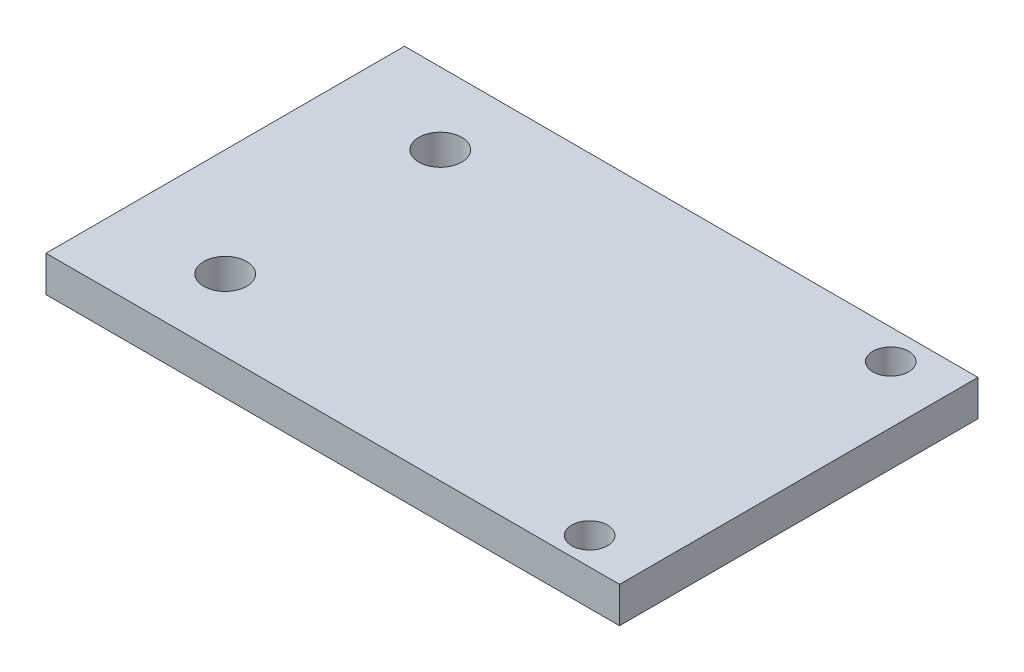
ISO-10303-21;
HEADER;
FILE_DESCRIPTION(('STEP AP214'),'2;1');
FILE_NAME('part.step','',(''),(''),'','','');
FILE_SCHEMA(('AUTOMOTIVE_DESIGN { 1 0 10303 214 1 1 1 1 }'));
ENDSEC;
DATA;
#1=APPLICATION_CONTEXT('core data for automotive mechanical design processes');
#2=APPLICATION_PROTOCOL_DEFINITION('international standard','automotive_design',2000,#1);
#3=PRODUCT_CONTEXT('',#1,'mechanical');
#4=PRODUCT('Part','Part','',(#3));
#5=PRODUCT_RELATED_PRODUCT_CATEGORY('part','',(#4));
#6=PRODUCT_DEFINITION_FORMATION('','',#4);
#7=PRODUCT_DEFINITION_CONTEXT('part definition',#1,'design');
#8=PRODUCT_DEFINITION('design','',#6,#7);
#9=PRODUCT_DEFINITION_SHAPE('','',#8);
#10=(LENGTH_UNIT() NAMED_UNIT(*) SI_UNIT(.MILLI.,.METRE.));
#11=(NAMED_UNIT(*) PLANE_ANGLE_UNIT() SI_UNIT($,.RADIAN.));
#12=(NAMED_UNIT(*) SI_UNIT($,.STERADIAN.) SOLID_ANGLE_UNIT());
#13=UNCERTAINTY_MEASURE_WITH_UNIT(LENGTH_MEASURE(1.E-05),#10,'distance_accuracy_value','');
#14=(GEOMETRIC_REPRESENTATION_CONTEXT(3) GLOBAL_UNCERTAINTY_ASSIGNED_CONTEXT((#13)) GLOBAL_UNIT_ASSIGNED_CONTEXT((#10,
#11,#12)) REPRESENTATION_CONTEXT('',''));
#15=CARTESIAN_POINT('',(0.,0.,0.));
#16=DIRECTION('',(0.,0.,1.));
#17=DIRECTION('',(1.,0.,0.));
#18=AXIS2_PLACEMENT_3D('',#15,#16,#17);
#19=CARTESIAN_POINT('',(0.,5.,0.));
#20=DIRECTION('',(0.,-1.,0.));
#21=DIRECTION('',(0.,0.,-1.));
#22=AXIS2_PLACEMENT_3D('',#19,#20,#21);
#23=PLANE('',#22);
#24=CARTESIAN_POINT('',(72.0000000000001,5.,-45.8280269591615));
#25=DIRECTION('',(0.,1.,0.));
#26=DIRECTION('',(0.,0.,1.));
#27=AXIS2_PLACEMENT_3D('',#24,#25,#26);
#28=CIRCLE('',#27,2.5);
#29=CARTESIAN_POINT('',(72.0000000000001,5.,-43.3280269591616));
#30=VERTEX_POINT('',#29);
#31=EDGE_CURVE('E122',#30,#30,#28,.T.);
#32=ORIENTED_EDGE('',*,*,#31,.F.);
#33=EDGE_LOOP('',(#32));
#34=FACE_BOUND('',#33,.T.);
#35=CARTESIAN_POINT('',(72.0000000000003,5.,-3.82802695916155));
#36=DIRECTION('',(0.,1.,0.));
#37=DIRECTION('',(0.,0.,1.));
#38=AXIS2_PLACEMENT_3D('',#35,#36,#37);
#39=CIRCLE('',#38,2.49999999999999);
#40=CARTESIAN_POINT('',(72.0000000000003,5.,-1.32802695916155));
#41=VERTEX_POINT('',#40);
#42=EDGE_CURVE('E111',#41,#41,#39,.T.);
#43=ORIENTED_EDGE('',*,*,#42,.F.);
#44=EDGE_LOOP('',(#43));
#45=FACE_BOUND('',#44,.T.);
#46=DIRECTION('',(0.,0.,1.));
#47=VECTOR('',#46,1.);
#48=CARTESIAN_POINT('',(0.,5.,0.));
#49=LINE('',#48,#47);
#50=CARTESIAN_POINT('',(0.,5.,-50.));
#51=VERTEX_POINT('',#50);
#52=CARTESIAN_POINT('',(0.,5.,0.));
#53=VERTEX_POINT('',#52);
#54=EDGE_CURVE('E87',#51,#53,#49,.T.);
#55=ORIENTED_EDGE('',*,*,#54,.T.);
#56=DIRECTION('',(1.,0.,0.));
#57=VECTOR('',#56,1.);
#58=CARTESIAN_POINT('',(0.,5.,0.));
#59=LINE('',#58,#57);
#60=CARTESIAN_POINT('',(80.,5.,0.));
#61=VERTEX_POINT('',#60);
#62=EDGE_CURVE('E82',#53,#61,#59,.T.);
#63=ORIENTED_EDGE('',*,*,#62,.T.);
#64=DIRECTION('',(0.,0.,-1.));
#65=VECTOR('',#64,1.);
#66=CARTESIAN_POINT('',(80.,5.,0.));
#67=LINE('',#66,#65);
#68=CARTESIAN_POINT('',(80.,5.,-50.));
#69=VERTEX_POINT('',#68);
#70=EDGE_CURVE('E85',#61,#69,#67,.T.);
#71=ORIENTED_EDGE('',*,*,#70,.T.);
#72=DIRECTION('',(-1.,0.,0.));
#73=VECTOR('',#72,1.);
#74=CARTESIAN_POINT('',(0.,5.,-50.));
#75=LINE('',#74,#73);
#76=EDGE_CURVE('E52',#69,#51,#75,.T.);
#77=ORIENTED_EDGE('',*,*,#76,.T.);
#78=EDGE_LOOP('',(#55,#63,#71,#77));
#79=FACE_BOUND('',#78,.T.);
#80=CARTESIAN_POINT('',(15.,5.,-40.));
#81=DIRECTION('',(0.,1.,0.));
#82=DIRECTION('',(0.,0.,1.));
#83=AXIS2_PLACEMENT_3D('',#80,#81,#82);
#84=CIRCLE('',#83,3.);
#85=CARTESIAN_POINT('',(15.,5.,-37.));
#86=VERTEX_POINT('',#85);
#87=EDGE_CURVE('E103',#86,#86,#84,.T.);
#88=ORIENTED_EDGE('',*,*,#87,.F.);
#89=EDGE_LOOP('',(#88));
#90=FACE_BOUND('',#89,.T.);
#91=CARTESIAN_POINT('',(15.,5.,-10.));
#92=DIRECTION('',(0.,1.,0.));
#93=DIRECTION('',(0.,0.,1.));
#94=AXIS2_PLACEMENT_3D('',#91,#92,#93);
#95=CIRCLE('',#94,3.);
#96=CARTESIAN_POINT('',(15.,5.,-7.00000000000001));
#97=VERTEX_POINT('',#96);
#98=EDGE_CURVE('E115',#97,#97,#95,.T.);
#99=ORIENTED_EDGE('',*,*,#98,.F.);
#100=EDGE_LOOP('',(#99));
#101=FACE_BOUND('',#100,.T.);
#102=ADVANCED_FACE('F33',(#34,#45,#79,#90,#101),#23,.F.);
#103=CARTESIAN_POINT('',(0.,0.,0.));
#104=DIRECTION('',(0.,-1.,0.));
#105=DIRECTION('',(0.,0.,-1.));
#106=AXIS2_PLACEMENT_3D('',#103,#104,#105);
#107=PLANE('',#106);
#108=CARTESIAN_POINT('',(72.0000000000001,0.,-45.8280269591615));
#109=DIRECTION('',(0.,-1.,0.));
#110=DIRECTION('',(0.,0.,-1.));
#111=AXIS2_PLACEMENT_3D('',#108,#109,#110);
#112=CIRCLE('',#111,2.5);
#113=CARTESIAN_POINT('',(72.0000000000001,0.,-48.3280269591615));
#114=VERTEX_POINT('',#113);
#115=EDGE_CURVE('E37',#114,#114,#112,.T.);
#116=ORIENTED_EDGE('',*,*,#115,.F.);
#117=EDGE_LOOP('',(#116));
#118=FACE_BOUND('',#117,.T.);
#119=CARTESIAN_POINT('',(72.0000000000003,0.,-3.82802695916155));
#120=DIRECTION('',(0.,-1.,0.));
#121=DIRECTION('',(0.,0.,-1.));
#122=AXIS2_PLACEMENT_3D('',#119,#120,#121);
#123=CIRCLE('',#122,2.49999999999999);
#124=CARTESIAN_POINT('',(72.0000000000003,0.,-6.32802695916154));
#125=VERTEX_POINT('',#124);
#126=EDGE_CURVE('E108',#125,#125,#123,.T.);
#127=ORIENTED_EDGE('',*,*,#126,.F.);
#128=EDGE_LOOP('',(#127));
#129=FACE_BOUND('',#128,.T.);
#130=CARTESIAN_POINT('',(15.,0.,-40.));
#131=DIRECTION('',(0.,1.,0.));
#132=DIRECTION('',(0.,0.,1.));
#133=AXIS2_PLACEMENT_3D('',#130,#131,#132);
#134=CIRCLE('',#133,3.);
#135=CARTESIAN_POINT('',(15.,0.,-37.));
#136=VERTEX_POINT('',#135);
#137=EDGE_CURVE('E126',#136,#136,#134,.T.);
#138=ORIENTED_EDGE('',*,*,#137,.T.);
#139=EDGE_LOOP('',(#138));
#140=FACE_BOUND('',#139,.T.);
#141=DIRECTION('',(0.,0.,1.));
#142=VECTOR('',#141,1.);
#143=CARTESIAN_POINT('',(0.,0.,0.));
#144=LINE('',#143,#142);
#145=CARTESIAN_POINT('',(0.,0.,-50.));
#146=VERTEX_POINT('',#145);
#147=CARTESIAN_POINT('',(0.,0.,0.));
#148=VERTEX_POINT('',#147);
#149=EDGE_CURVE('E100',#146,#148,#144,.T.);
#150=ORIENTED_EDGE('',*,*,#149,.F.);
#151=DIRECTION('',(-1.,0.,0.));
#152=VECTOR('',#151,1.);
#153=CARTESIAN_POINT('',(0.,0.,-50.));
#154=LINE('',#153,#152);
#155=CARTESIAN_POINT('',(80.,0.,-50.));
#156=VERTEX_POINT('',#155);
#157=EDGE_CURVE('E75',#156,#146,#154,.T.);
#158=ORIENTED_EDGE('',*,*,#157,.F.);
#159=DIRECTION('',(0.,0.,-1.));
#160=VECTOR('',#159,1.);
#161=CARTESIAN_POINT('',(80.,0.,0.));
#162=LINE('',#161,#160);
#163=CARTESIAN_POINT('',(80.,0.,0.));
#164=VERTEX_POINT('',#163);
#165=EDGE_CURVE('E69',#164,#156,#162,.T.);
#166=ORIENTED_EDGE('',*,*,#165,.F.);
#167=DIRECTION('',(1.,0.,0.));
#168=VECTOR('',#167,1.);
#169=CARTESIAN_POINT('',(0.,0.,0.));
#170=LINE('',#169,#168);
#171=EDGE_CURVE('E91',#148,#164,#170,.T.);
#172=ORIENTED_EDGE('',*,*,#171,.F.);
#173=EDGE_LOOP('',(#150,#158,#166,#172));
#174=FACE_BOUND('',#173,.T.);
#175=CARTESIAN_POINT('',(15.,0.,-10.));
#176=DIRECTION('',(0.,1.,0.));
#177=DIRECTION('',(0.,0.,1.));
#178=AXIS2_PLACEMENT_3D('',#175,#176,#177);
#179=CIRCLE('',#178,3.);
#180=CARTESIAN_POINT('',(15.,0.,-7.00000000000001));
#181=VERTEX_POINT('',#180);
#182=EDGE_CURVE('E110',#181,#181,#179,.T.);
#183=ORIENTED_EDGE('',*,*,#182,.T.);
#184=EDGE_LOOP('',(#183));
#185=FACE_BOUND('',#184,.T.);
#186=ADVANCED_FACE('F133',(#118,#129,#140,#174,#185),#107,.T.);
#187=CARTESIAN_POINT('',(0.,5.,0.));
#188=DIRECTION('',(1.,0.,0.));
#189=DIRECTION('',(0.,0.,-1.));
#190=AXIS2_PLACEMENT_3D('',#187,#188,#189);
#191=PLANE('',#190);
#192=ORIENTED_EDGE('',*,*,#149,.T.);
#193=DIRECTION('',(0.,-1.,0.));
#194=VECTOR('',#193,1.);
#195=CARTESIAN_POINT('',(0.,5.,0.));
#196=LINE('',#195,#194);
#197=EDGE_CURVE('E11',#53,#148,#196,.T.);
#198=ORIENTED_EDGE('',*,*,#197,.F.);
#199=ORIENTED_EDGE('',*,*,#54,.F.);
#200=DIRECTION('',(0.,-1.,0.));
#201=VECTOR('',#200,1.);
#202=CARTESIAN_POINT('',(0.,5.,-50.));
#203=LINE('',#202,#201);
#204=EDGE_CURVE('E96',#51,#146,#203,.T.);
#205=ORIENTED_EDGE('',*,*,#204,.T.);
#206=EDGE_LOOP('',(#192,#198,#199,#205));
#207=FACE_BOUND('',#206,.T.);
#208=ADVANCED_FACE('F35',(#207),#191,.F.);
#209=CARTESIAN_POINT('',(0.,5.,0.));
#210=DIRECTION('',(0.,0.,-1.));
#211=DIRECTION('',(-1.,0.,0.));
#212=AXIS2_PLACEMENT_3D('',#209,#210,#211);
#213=PLANE('',#212);
#214=ORIENTED_EDGE('',*,*,#171,.T.);
#215=DIRECTION('',(0.,-1.,0.));
#216=VECTOR('',#215,1.);
#217=CARTESIAN_POINT('',(80.,5.,0.));
#218=LINE('',#217,#216);
#219=EDGE_CURVE('E43',#61,#164,#218,.T.);
#220=ORIENTED_EDGE('',*,*,#219,.F.);
#221=ORIENTED_EDGE('',*,*,#62,.F.);
#222=ORIENTED_EDGE('',*,*,#197,.T.);
#223=EDGE_LOOP('',(#214,#220,#221,#222));
#224=FACE_BOUND('',#223,.T.);
#225=ADVANCED_FACE('F90',(#224),#213,.F.);
#226=CARTESIAN_POINT('',(80.,5.,0.));
#227=DIRECTION('',(-1.,0.,0.));
#228=DIRECTION('',(0.,0.,1.));
#229=AXIS2_PLACEMENT_3D('',#226,#227,#228);
#230=PLANE('',#229);
#231=ORIENTED_EDGE('',*,*,#165,.T.);
#232=DIRECTION('',(0.,-1.,0.));
#233=VECTOR('',#232,1.);
#234=CARTESIAN_POINT('',(80.,5.,-50.));
#235=LINE('',#234,#233);
#236=EDGE_CURVE('E92',#69,#156,#235,.T.);
#237=ORIENTED_EDGE('',*,*,#236,.F.);
#238=ORIENTED_EDGE('',*,*,#70,.F.);
#239=ORIENTED_EDGE('',*,*,#219,.T.);
#240=EDGE_LOOP('',(#231,#237,#238,#239));
#241=FACE_BOUND('',#240,.T.);
#242=ADVANCED_FACE('F94',(#241),#230,.F.);
#243=CARTESIAN_POINT('',(0.,5.,-50.));
#244=DIRECTION('',(0.,0.,1.));
#245=DIRECTION('',(1.,0.,0.));
#246=AXIS2_PLACEMENT_3D('',#243,#244,#245);
#247=PLANE('',#246);
#248=ORIENTED_EDGE('',*,*,#157,.T.);
#249=ORIENTED_EDGE('',*,*,#204,.F.);
#250=ORIENTED_EDGE('',*,*,#76,.F.);
#251=ORIENTED_EDGE('',*,*,#236,.T.);
#252=EDGE_LOOP('',(#248,#249,#250,#251));
#253=FACE_BOUND('',#252,.T.);
#254=ADVANCED_FACE('F139',(#253),#247,.F.);
#255=CARTESIAN_POINT('',(15.,5.,-40.));
#256=DIRECTION('',(0.,-1.,0.));
#257=DIRECTION('',(0.,0.,-1.));
#258=AXIS2_PLACEMENT_3D('',#255,#256,#257);
#259=CYLINDRICAL_SURFACE('',#258,3.);
#260=ORIENTED_EDGE('',*,*,#87,.T.);
#261=EDGE_LOOP('',(#260));
#262=FACE_BOUND('',#261,.T.);
#263=ORIENTED_EDGE('',*,*,#137,.F.);
#264=EDGE_LOOP('',(#263));
#265=FACE_BOUND('',#264,.T.);
#266=ADVANCED_FACE('F136',(#262,#265),#259,.F.);
#267=CARTESIAN_POINT('',(15.,5.,-10.));
#268=DIRECTION('',(0.,-1.,0.));
#269=DIRECTION('',(0.,0.,-1.));
#270=AXIS2_PLACEMENT_3D('',#267,#268,#269);
#271=CYLINDRICAL_SURFACE('',#270,3.);
#272=ORIENTED_EDGE('',*,*,#98,.T.);
#273=EDGE_LOOP('',(#272));
#274=FACE_BOUND('',#273,.T.);
#275=ORIENTED_EDGE('',*,*,#182,.F.);
#276=EDGE_LOOP('',(#275));
#277=FACE_BOUND('',#276,.T.);
#278=ADVANCED_FACE('F138',(#274,#277),#271,.F.);
#279=CARTESIAN_POINT('',(72.0000000000003,-5.,-3.82802695916155));
#280=DIRECTION('',(0.,1.,0.));
#281=DIRECTION('',(0.,0.,1.));
#282=AXIS2_PLACEMENT_3D('',#279,#280,#281);
#283=CYLINDRICAL_SURFACE('',#282,2.49999999999999);
#284=ORIENTED_EDGE('',*,*,#126,.T.);
#285=EDGE_LOOP('',(#284));
#286=FACE_BOUND('',#285,.T.);
#287=ORIENTED_EDGE('',*,*,#42,.T.);
#288=EDGE_LOOP('',(#287));
#289=FACE_BOUND('',#288,.T.);
#290=ADVANCED_FACE('F146',(#286,#289),#283,.F.);
#291=CARTESIAN_POINT('',(72.0000000000001,-5.,-45.8280269591615));
#292=DIRECTION('',(0.,1.,0.));
#293=DIRECTION('',(0.,0.,1.));
#294=AXIS2_PLACEMENT_3D('',#291,#292,#293);
#295=CYLINDRICAL_SURFACE('',#294,2.5);
#296=ORIENTED_EDGE('',*,*,#115,.T.);
#297=EDGE_LOOP('',(#296));
#298=FACE_BOUND('',#297,.T.);
#299=ORIENTED_EDGE('',*,*,#31,.T.);
#300=EDGE_LOOP('',(#299));
#301=FACE_BOUND('',#300,.T.);
#302=ADVANCED_FACE('F191',(#298,#301),#295,.F.);
#303=CLOSED_SHELL('',(#102,#186,#208,#225,#242,#254,#266,#278,#290,#302));
#304=MANIFOLD_SOLID_BREP('B2',#303);
#305=ADVANCED_BREP_SHAPE_REPRESENTATION('',(#18,#304),#14);
#306=SHAPE_DEFINITION_REPRESENTATION(#9,#305);
ENDSEC;
END-ISO-10303-21;
